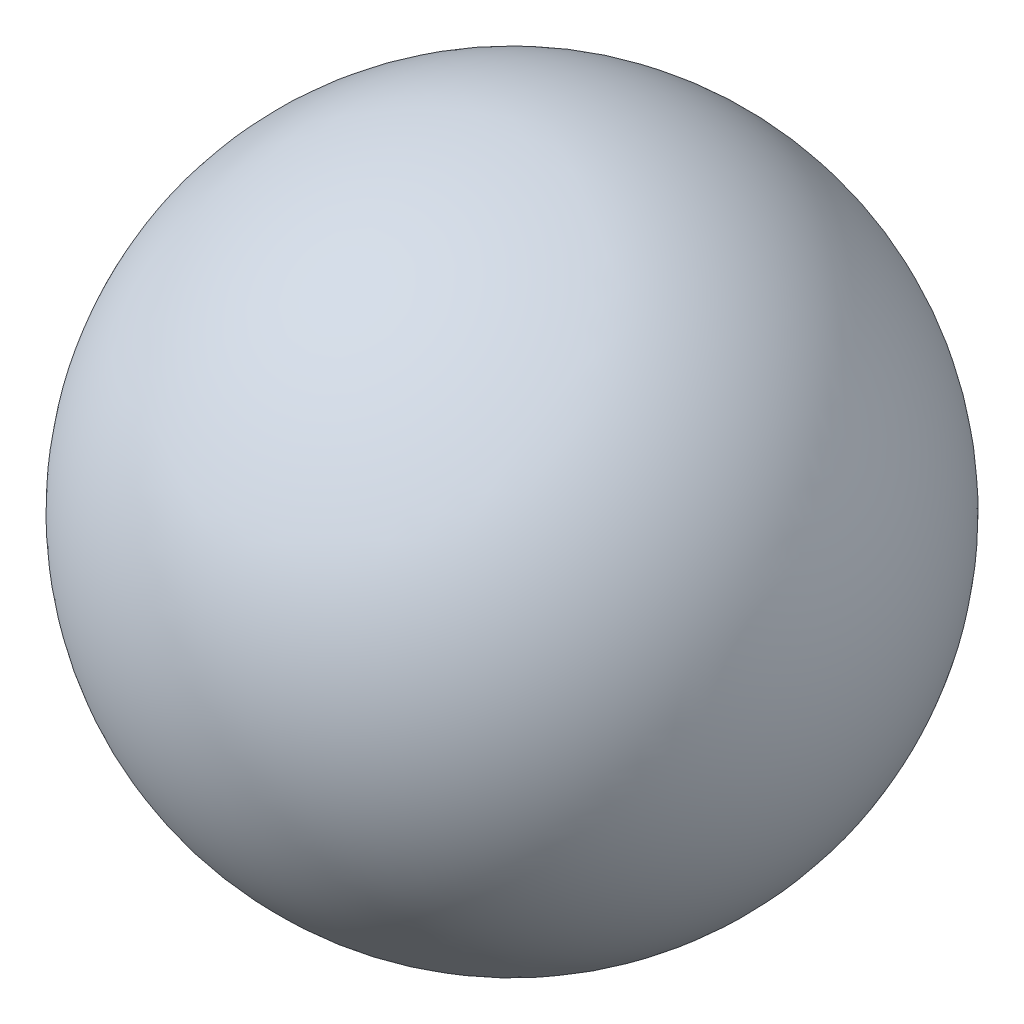
ISO-10303-21;
HEADER;
FILE_DESCRIPTION(('STEP AP214'),'2;1');
FILE_NAME('part.step','',(''),(''),'','','');
FILE_SCHEMA(('AUTOMOTIVE_DESIGN { 1 0 10303 214 1 1 1 1 }'));
ENDSEC;
DATA;
#1=APPLICATION_CONTEXT('core data for automotive mechanical design processes');
#2=APPLICATION_PROTOCOL_DEFINITION('international standard','automotive_design',2000,#1);
#3=PRODUCT_CONTEXT('',#1,'mechanical');
#4=PRODUCT('Part','Part','',(#3));
#5=PRODUCT_RELATED_PRODUCT_CATEGORY('part','',(#4));
#6=PRODUCT_DEFINITION_FORMATION('','',#4);
#7=PRODUCT_DEFINITION_CONTEXT('part definition',#1,'design');
#8=PRODUCT_DEFINITION('design','',#6,#7);
#9=PRODUCT_DEFINITION_SHAPE('','',#8);
#10=(LENGTH_UNIT() NAMED_UNIT(*) SI_UNIT(.MILLI.,.METRE.));
#11=(NAMED_UNIT(*) PLANE_ANGLE_UNIT() SI_UNIT($,.RADIAN.));
#12=(NAMED_UNIT(*) SI_UNIT($,.STERADIAN.) SOLID_ANGLE_UNIT());
#13=UNCERTAINTY_MEASURE_WITH_UNIT(LENGTH_MEASURE(1.E-05),#10,'distance_accuracy_value','');
#14=(GEOMETRIC_REPRESENTATION_CONTEXT(3) GLOBAL_UNCERTAINTY_ASSIGNED_CONTEXT((#13)) GLOBAL_UNIT_ASSIGNED_CONTEXT((#10,
#11,#12)) REPRESENTATION_CONTEXT('',''));
#15=CARTESIAN_POINT('',(0.,0.,0.));
#16=DIRECTION('',(0.,0.,1.));
#17=DIRECTION('',(1.,0.,0.));
#18=AXIS2_PLACEMENT_3D('',#15,#16,#17);
#19=CARTESIAN_POINT('',(6.9999999999999,1.11022302462516E-13,-6.99999999999921));
#20=DIRECTION('',(-0.999999999999998,0.,0.));
#21=DIRECTION('',(0.,0.,-0.999999999999987));
#22=AXIS2_PLACEMENT_3D('',#19,#20,#21);
#23=SPHERICAL_SURFACE('',#22,4.8);
#24=CARTESIAN_POINT('',(2.19999999999991,1.14619425062301E-13,-6.99999999999921));
#25=VERTEX_POINT('',#24);
#26=VERTEX_LOOP('',#25);
#27=FACE_BOUND('',#26,.T.);
#28=ADVANCED_FACE('F32',(#27),#23,.T.);
#29=CLOSED_SHELL('',(#28));
#30=MANIFOLD_SOLID_BREP('B2',#29);
#31=ADVANCED_BREP_SHAPE_REPRESENTATION('',(#18,#30),#14);
#32=SHAPE_DEFINITION_REPRESENTATION(#9,#31);
ENDSEC;
END-ISO-10303-21;
